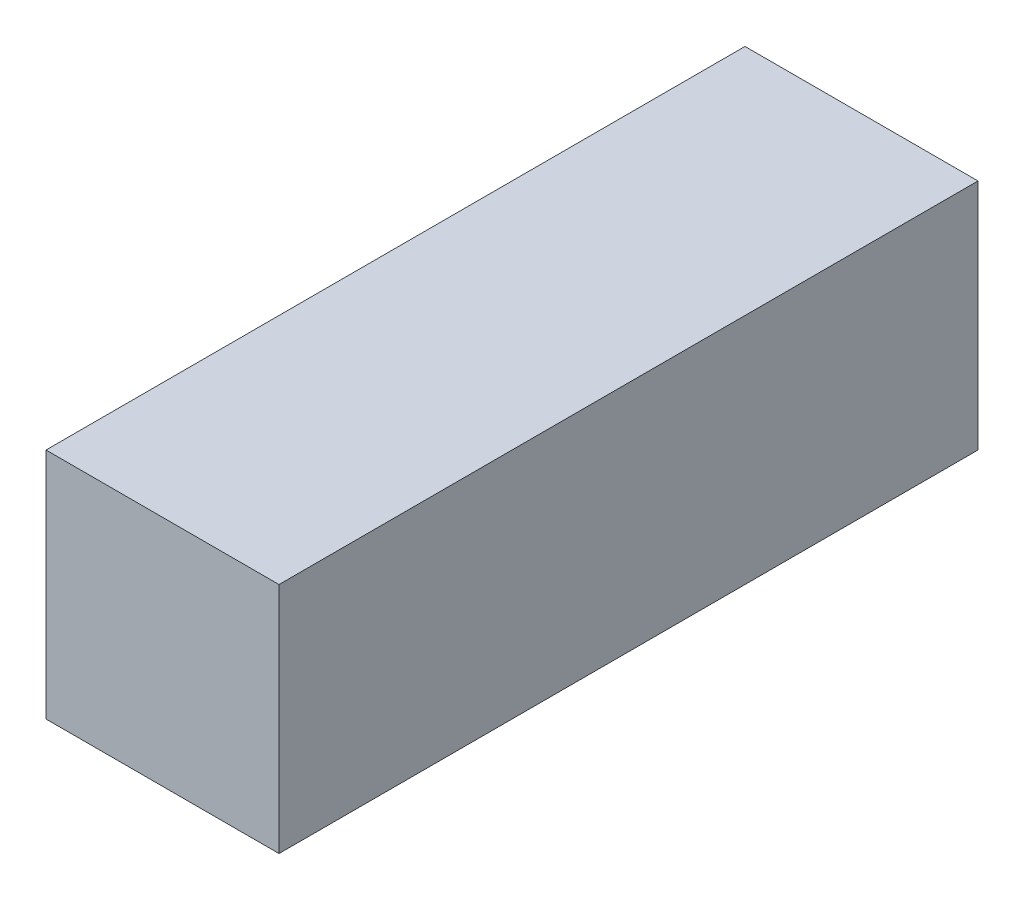
ISO-10303-21;
HEADER;
FILE_DESCRIPTION(('STEP AP214'),'2;1');
FILE_NAME('part.step','',(''),(''),'','','');
FILE_SCHEMA(('AUTOMOTIVE_DESIGN { 1 0 10303 214 1 1 1 1 }'));
ENDSEC;
DATA;
#1=APPLICATION_CONTEXT('core data for automotive mechanical design processes');
#2=APPLICATION_PROTOCOL_DEFINITION('international standard','automotive_design',2000,#1);
#3=PRODUCT_CONTEXT('',#1,'mechanical');
#4=PRODUCT('Part','Part','',(#3));
#5=PRODUCT_RELATED_PRODUCT_CATEGORY('part','',(#4));
#6=PRODUCT_DEFINITION_FORMATION('','',#4);
#7=PRODUCT_DEFINITION_CONTEXT('part definition',#1,'design');
#8=PRODUCT_DEFINITION('design','',#6,#7);
#9=PRODUCT_DEFINITION_SHAPE('','',#8);
#10=(LENGTH_UNIT() NAMED_UNIT(*) SI_UNIT(.MILLI.,.METRE.));
#11=(NAMED_UNIT(*) PLANE_ANGLE_UNIT() SI_UNIT($,.RADIAN.));
#12=(NAMED_UNIT(*) SI_UNIT($,.STERADIAN.) SOLID_ANGLE_UNIT());
#13=UNCERTAINTY_MEASURE_WITH_UNIT(LENGTH_MEASURE(1.E-05),#10,'distance_accuracy_value','');
#14=(GEOMETRIC_REPRESENTATION_CONTEXT(3) GLOBAL_UNCERTAINTY_ASSIGNED_CONTEXT((#13)) GLOBAL_UNIT_ASSIGNED_CONTEXT((#10,
#11,#12)) REPRESENTATION_CONTEXT('',''));
#15=CARTESIAN_POINT('',(0.,0.,0.));
#16=DIRECTION('',(0.,0.,1.));
#17=DIRECTION('',(1.,0.,0.));
#18=AXIS2_PLACEMENT_3D('',#15,#16,#17);
#19=CARTESIAN_POINT('',(0.,0.,15.));
#20=DIRECTION('',(1.,0.,0.));
#21=DIRECTION('',(0.,0.,-1.));
#22=AXIS2_PLACEMENT_3D('',#19,#20,#21);
#23=PLANE('',#22);
#24=DIRECTION('',(0.,-1.,0.));
#25=VECTOR('',#24,1.);
#26=CARTESIAN_POINT('',(0.,0.,0.));
#27=LINE('',#26,#25);
#28=CARTESIAN_POINT('',(0.,5.,0.));
#29=VERTEX_POINT('',#28);
#30=CARTESIAN_POINT('',(0.,0.,0.));
#31=VERTEX_POINT('',#30);
#32=EDGE_CURVE('E115',#29,#31,#27,.T.);
#33=ORIENTED_EDGE('',*,*,#32,.T.);
#34=DIRECTION('',(0.,0.,-1.));
#35=VECTOR('',#34,1.);
#36=CARTESIAN_POINT('',(0.,0.,15.));
#37=LINE('',#36,#35);
#38=CARTESIAN_POINT('',(0.,0.,15.));
#39=VERTEX_POINT('',#38);
#40=EDGE_CURVE('E11',#39,#31,#37,.T.);
#41=ORIENTED_EDGE('',*,*,#40,.F.);
#42=DIRECTION('',(0.,-1.,0.));
#43=VECTOR('',#42,1.);
#44=CARTESIAN_POINT('',(0.,0.,15.));
#45=LINE('',#44,#43);
#46=CARTESIAN_POINT('',(0.,5.,15.));
#47=VERTEX_POINT('',#46);
#48=EDGE_CURVE('E98',#47,#39,#45,.T.);
#49=ORIENTED_EDGE('',*,*,#48,.F.);
#50=DIRECTION('',(0.,0.,-1.));
#51=VECTOR('',#50,1.);
#52=CARTESIAN_POINT('',(0.,5.,15.));
#53=LINE('',#52,#51);
#54=EDGE_CURVE('E111',#47,#29,#53,.T.);
#55=ORIENTED_EDGE('',*,*,#54,.T.);
#56=EDGE_LOOP('',(#33,#41,#49,#55));
#57=FACE_BOUND('',#56,.T.);
#58=ADVANCED_FACE('F46',(#57),#23,.F.);
#59=CARTESIAN_POINT('',(0.,0.,15.));
#60=DIRECTION('',(0.,1.,0.));
#61=DIRECTION('',(0.,0.,1.));
#62=AXIS2_PLACEMENT_3D('',#59,#60,#61);
#63=PLANE('',#62);
#64=DIRECTION('',(1.,0.,0.));
#65=VECTOR('',#64,1.);
#66=CARTESIAN_POINT('',(0.,0.,0.));
#67=LINE('',#66,#65);
#68=CARTESIAN_POINT('',(5.,0.,0.));
#69=VERTEX_POINT('',#68);
#70=EDGE_CURVE('E103',#31,#69,#67,.T.);
#71=ORIENTED_EDGE('',*,*,#70,.T.);
#72=DIRECTION('',(0.,0.,-1.));
#73=VECTOR('',#72,1.);
#74=CARTESIAN_POINT('',(5.,0.,15.));
#75=LINE('',#74,#73);
#76=CARTESIAN_POINT('',(5.,0.,15.));
#77=VERTEX_POINT('',#76);
#78=EDGE_CURVE('E55',#77,#69,#75,.T.);
#79=ORIENTED_EDGE('',*,*,#78,.F.);
#80=DIRECTION('',(1.,0.,0.));
#81=VECTOR('',#80,1.);
#82=CARTESIAN_POINT('',(0.,0.,15.));
#83=LINE('',#82,#81);
#84=EDGE_CURVE('E93',#39,#77,#83,.T.);
#85=ORIENTED_EDGE('',*,*,#84,.F.);
#86=ORIENTED_EDGE('',*,*,#40,.T.);
#87=EDGE_LOOP('',(#71,#79,#85,#86));
#88=FACE_BOUND('',#87,.T.);
#89=ADVANCED_FACE('F102',(#88),#63,.F.);
#90=CARTESIAN_POINT('',(5.,0.,15.));
#91=DIRECTION('',(-1.,0.,0.));
#92=DIRECTION('',(0.,0.,1.));
#93=AXIS2_PLACEMENT_3D('',#90,#91,#92);
#94=PLANE('',#93);
#95=DIRECTION('',(0.,1.,0.));
#96=VECTOR('',#95,1.);
#97=CARTESIAN_POINT('',(5.,0.,0.));
#98=LINE('',#97,#96);
#99=CARTESIAN_POINT('',(5.,5.,0.));
#100=VERTEX_POINT('',#99);
#101=EDGE_CURVE('E80',#69,#100,#98,.T.);
#102=ORIENTED_EDGE('',*,*,#101,.T.);
#103=DIRECTION('',(0.,0.,-1.));
#104=VECTOR('',#103,1.);
#105=CARTESIAN_POINT('',(5.,5.,15.));
#106=LINE('',#105,#104);
#107=CARTESIAN_POINT('',(5.,5.,15.));
#108=VERTEX_POINT('',#107);
#109=EDGE_CURVE('E105',#108,#100,#106,.T.);
#110=ORIENTED_EDGE('',*,*,#109,.F.);
#111=DIRECTION('',(0.,1.,0.));
#112=VECTOR('',#111,1.);
#113=CARTESIAN_POINT('',(5.,0.,15.));
#114=LINE('',#113,#112);
#115=EDGE_CURVE('E96',#77,#108,#114,.T.);
#116=ORIENTED_EDGE('',*,*,#115,.F.);
#117=ORIENTED_EDGE('',*,*,#78,.T.);
#118=EDGE_LOOP('',(#102,#110,#116,#117));
#119=FACE_BOUND('',#118,.T.);
#120=ADVANCED_FACE('F106',(#119),#94,.F.);
#121=CARTESIAN_POINT('',(0.,5.,15.));
#122=DIRECTION('',(0.,-1.,0.));
#123=DIRECTION('',(0.,0.,-1.));
#124=AXIS2_PLACEMENT_3D('',#121,#122,#123);
#125=PLANE('',#124);
#126=DIRECTION('',(-1.,0.,0.));
#127=VECTOR('',#126,1.);
#128=CARTESIAN_POINT('',(0.,5.,0.));
#129=LINE('',#128,#127);
#130=EDGE_CURVE('E86',#100,#29,#129,.T.);
#131=ORIENTED_EDGE('',*,*,#130,.T.);
#132=ORIENTED_EDGE('',*,*,#54,.F.);
#133=DIRECTION('',(-1.,0.,0.));
#134=VECTOR('',#133,1.);
#135=CARTESIAN_POINT('',(0.,5.,15.));
#136=LINE('',#135,#134);
#137=EDGE_CURVE('E63',#108,#47,#136,.T.);
#138=ORIENTED_EDGE('',*,*,#137,.F.);
#139=ORIENTED_EDGE('',*,*,#109,.T.);
#140=EDGE_LOOP('',(#131,#132,#138,#139));
#141=FACE_BOUND('',#140,.T.);
#142=ADVANCED_FACE('F127',(#141),#125,.F.);
#143=CARTESIAN_POINT('',(0.,0.,15.));
#144=DIRECTION('',(0.,0.,-1.));
#145=DIRECTION('',(-1.,0.,0.));
#146=AXIS2_PLACEMENT_3D('',#143,#144,#145);
#147=PLANE('',#146);
#148=ORIENTED_EDGE('',*,*,#48,.T.);
#149=ORIENTED_EDGE('',*,*,#84,.T.);
#150=ORIENTED_EDGE('',*,*,#115,.T.);
#151=ORIENTED_EDGE('',*,*,#137,.T.);
#152=EDGE_LOOP('',(#148,#149,#150,#151));
#153=FACE_BOUND('',#152,.T.);
#154=ADVANCED_FACE('F94',(#153),#147,.F.);
#155=CARTESIAN_POINT('',(0.,0.,0.));
#156=DIRECTION('',(0.,0.,-1.));
#157=DIRECTION('',(-1.,0.,0.));
#158=AXIS2_PLACEMENT_3D('',#155,#156,#157);
#159=PLANE('',#158);
#160=ORIENTED_EDGE('',*,*,#32,.F.);
#161=ORIENTED_EDGE('',*,*,#130,.F.);
#162=ORIENTED_EDGE('',*,*,#101,.F.);
#163=ORIENTED_EDGE('',*,*,#70,.F.);
#164=EDGE_LOOP('',(#160,#161,#162,#163));
#165=FACE_BOUND('',#164,.T.);
#166=ADVANCED_FACE('F130',(#165),#159,.T.);
#167=CLOSED_SHELL('',(#58,#89,#120,#142,#154,#166));
#168=MANIFOLD_SOLID_BREP('B2',#167);
#169=ADVANCED_BREP_SHAPE_REPRESENTATION('',(#18,#168),#14);
#170=SHAPE_DEFINITION_REPRESENTATION(#9,#169);
ENDSEC;
END-ISO-10303-21;
